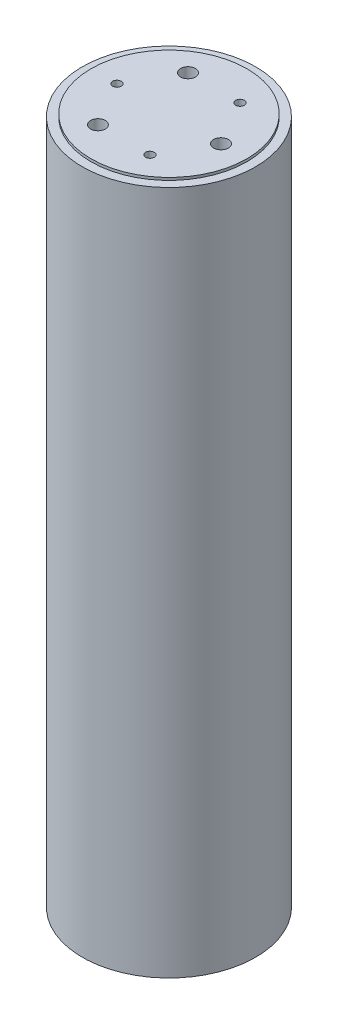
ISO-10303-21;
HEADER;
FILE_DESCRIPTION(('STEP AP214'),'2;1');
FILE_NAME('part.step','',(''),(''),'','','');
FILE_SCHEMA(('AUTOMOTIVE_DESIGN { 1 0 10303 214 1 1 1 1 }'));
ENDSEC;
DATA;
#1=APPLICATION_CONTEXT('core data for automotive mechanical design processes');
#2=APPLICATION_PROTOCOL_DEFINITION('international standard','automotive_design',2000,#1);
#3=PRODUCT_CONTEXT('',#1,'mechanical');
#4=PRODUCT('Part','Part','',(#3));
#5=PRODUCT_RELATED_PRODUCT_CATEGORY('part','',(#4));
#6=PRODUCT_DEFINITION_FORMATION('','',#4);
#7=PRODUCT_DEFINITION_CONTEXT('part definition',#1,'design');
#8=PRODUCT_DEFINITION('design','',#6,#7);
#9=PRODUCT_DEFINITION_SHAPE('','',#8);
#10=(LENGTH_UNIT() NAMED_UNIT(*) SI_UNIT(.MILLI.,.METRE.));
#11=(NAMED_UNIT(*) PLANE_ANGLE_UNIT() SI_UNIT($,.RADIAN.));
#12=(NAMED_UNIT(*) SI_UNIT($,.STERADIAN.) SOLID_ANGLE_UNIT());
#13=UNCERTAINTY_MEASURE_WITH_UNIT(LENGTH_MEASURE(1.E-05),#10,'distance_accuracy_value','');
#14=(GEOMETRIC_REPRESENTATION_CONTEXT(3) GLOBAL_UNCERTAINTY_ASSIGNED_CONTEXT((#13)) GLOBAL_UNIT_ASSIGNED_CONTEXT((#10,
#11,#12)) REPRESENTATION_CONTEXT('',''));
#15=CARTESIAN_POINT('',(0.,0.,0.));
#16=DIRECTION('',(0.,0.,1.));
#17=DIRECTION('',(1.,0.,0.));
#18=AXIS2_PLACEMENT_3D('',#15,#16,#17);
#19=CARTESIAN_POINT('',(0.,388.5,0.));
#20=DIRECTION('',(0.,-1.,0.));
#21=DIRECTION('',(0.,0.,-1.));
#22=AXIS2_PLACEMENT_3D('',#19,#20,#21);
#23=PLANE('',#22);
#24=CARTESIAN_POINT('',(30.,388.5,0.));
#25=DIRECTION('',(0.,-1.,0.));
#26=DIRECTION('',(0.,0.,-1.));
#27=AXIS2_PLACEMENT_3D('',#24,#25,#26);
#28=CIRCLE('',#27,4.28000000000001);
#29=CARTESIAN_POINT('',(30.,388.5,-4.28000000000001));
#30=VERTEX_POINT('',#29);
#31=EDGE_CURVE('E246',#30,#30,#28,.T.);
#32=ORIENTED_EDGE('',*,*,#31,.F.);
#33=EDGE_LOOP('',(#32));
#34=FACE_BOUND('',#33,.T.);
#35=CARTESIAN_POINT('',(-15.0000000000001,388.5,25.9807621135331));
#36=DIRECTION('',(0.,-1.,0.));
#37=DIRECTION('',(0.,0.,-1.));
#38=AXIS2_PLACEMENT_3D('',#35,#36,#37);
#39=CIRCLE('',#38,4.28);
#40=CARTESIAN_POINT('',(-15.0000000000001,388.5,21.7007621135331));
#41=VERTEX_POINT('',#40);
#42=EDGE_CURVE('E254',#41,#41,#39,.T.);
#43=ORIENTED_EDGE('',*,*,#42,.F.);
#44=EDGE_LOOP('',(#43));
#45=FACE_BOUND('',#44,.T.);
#46=CARTESIAN_POINT('',(-14.9999999999998,388.5,-25.9807621135333));
#47=DIRECTION('',(0.,-1.,0.));
#48=DIRECTION('',(0.,0.,-1.));
#49=AXIS2_PLACEMENT_3D('',#46,#47,#48);
#50=CIRCLE('',#49,4.28000000000001);
#51=CARTESIAN_POINT('',(-14.9999999999998,388.5,-30.2607621135333));
#52=VERTEX_POINT('',#51);
#53=EDGE_CURVE('E250',#52,#52,#50,.T.);
#54=ORIENTED_EDGE('',*,*,#53,.F.);
#55=EDGE_LOOP('',(#54));
#56=FACE_BOUND('',#55,.T.);
#57=CARTESIAN_POINT('',(0.,388.5,0.));
#58=DIRECTION('',(0.,-1.,0.));
#59=DIRECTION('',(0.,0.,-1.));
#60=AXIS2_PLACEMENT_3D('',#57,#58,#59);
#61=CIRCLE('',#60,48.);
#62=CARTESIAN_POINT('',(0.,388.5,-48.));
#63=VERTEX_POINT('',#62);
#64=EDGE_CURVE('E88',#63,#63,#61,.T.);
#65=ORIENTED_EDGE('',*,*,#64,.T.);
#66=EDGE_LOOP('',(#65));
#67=FACE_BOUND('',#66,.T.);
#68=ADVANCED_FACE('F45',(#34,#45,#56,#67),#23,.T.);
#69=CARTESIAN_POINT('',(0.,0.,0.));
#70=DIRECTION('',(0.,-1.,0.));
#71=DIRECTION('',(0.,0.,-1.));
#72=AXIS2_PLACEMENT_3D('',#69,#70,#71);
#73=CYLINDRICAL_SURFACE('',#72,48.);
#74=CARTESIAN_POINT('',(0.,9.5,0.));
#75=DIRECTION('',(0.,-1.,0.));
#76=DIRECTION('',(0.,0.,-1.));
#77=AXIS2_PLACEMENT_3D('',#74,#75,#76);
#78=CIRCLE('',#77,48.);
#79=CARTESIAN_POINT('',(0.,9.5,-48.));
#80=VERTEX_POINT('',#79);
#81=EDGE_CURVE('E85',#80,#80,#78,.T.);
#82=ORIENTED_EDGE('',*,*,#81,.T.);
#83=EDGE_LOOP('',(#82));
#84=FACE_BOUND('',#83,.T.);
#85=ORIENTED_EDGE('',*,*,#64,.F.);
#86=EDGE_LOOP('',(#85));
#87=FACE_BOUND('',#86,.T.);
#88=ADVANCED_FACE('F129',(#84,#87),#73,.F.);
#89=CARTESIAN_POINT('',(0.,9.5,-48.));
#90=DIRECTION('',(0.,1.,0.));
#91=DIRECTION('',(0.,0.,1.));
#92=AXIS2_PLACEMENT_3D('',#89,#90,#91);
#93=PLANE('',#92);
#94=CARTESIAN_POINT('',(0.,9.5,0.));
#95=DIRECTION('',(0.,1.,0.));
#96=DIRECTION('',(0.,0.,1.));
#97=AXIS2_PLACEMENT_3D('',#94,#95,#96);
#98=CIRCLE('',#97,5.7);
#99=CARTESIAN_POINT('',(0.,9.5,5.7));
#100=VERTEX_POINT('',#99);
#101=EDGE_CURVE('E89',#100,#100,#98,.T.);
#102=ORIENTED_EDGE('',*,*,#101,.F.);
#103=EDGE_LOOP('',(#102));
#104=FACE_BOUND('',#103,.T.);
#105=CARTESIAN_POINT('',(30.,9.5,0.));
#106=DIRECTION('',(0.,1.,0.));
#107=DIRECTION('',(0.,0.,1.));
#108=AXIS2_PLACEMENT_3D('',#105,#106,#107);
#109=CIRCLE('',#108,4.28000000000001);
#110=CARTESIAN_POINT('',(30.,9.5,4.28000000000001));
#111=VERTEX_POINT('',#110);
#112=EDGE_CURVE('E84',#111,#111,#109,.T.);
#113=ORIENTED_EDGE('',*,*,#112,.F.);
#114=EDGE_LOOP('',(#113));
#115=FACE_BOUND('',#114,.T.);
#116=ORIENTED_EDGE('',*,*,#81,.F.);
#117=EDGE_LOOP('',(#116));
#118=FACE_BOUND('',#117,.T.);
#119=ADVANCED_FACE('F135',(#104,#115,#118),#93,.T.);
#120=CARTESIAN_POINT('',(30.,33.,0.));
#121=DIRECTION('',(0.,-1.,0.));
#122=DIRECTION('',(0.,0.,-1.));
#123=AXIS2_PLACEMENT_3D('',#120,#121,#122);
#124=CYLINDRICAL_SURFACE('',#123,4.28000000000001);
#125=ORIENTED_EDGE('',*,*,#112,.T.);
#126=EDGE_LOOP('',(#125));
#127=FACE_BOUND('',#126,.T.);
#128=CARTESIAN_POINT('',(30.,0.,0.));
#129=DIRECTION('',(0.,-1.,0.));
#130=DIRECTION('',(0.,0.,-1.));
#131=AXIS2_PLACEMENT_3D('',#128,#129,#130);
#132=CIRCLE('',#131,4.28000000000001);
#133=CARTESIAN_POINT('',(30.,0.,-4.28000000000001));
#134=VERTEX_POINT('',#133);
#135=EDGE_CURVE('E66',#134,#134,#132,.T.);
#136=ORIENTED_EDGE('',*,*,#135,.T.);
#137=EDGE_LOOP('',(#136));
#138=FACE_BOUND('',#137,.T.);
#139=ADVANCED_FACE('F164',(#127,#138),#124,.F.);
#140=CARTESIAN_POINT('',(0.,33.,0.));
#141=DIRECTION('',(0.,-1.,0.));
#142=DIRECTION('',(0.,0.,-1.));
#143=AXIS2_PLACEMENT_3D('',#140,#141,#142);
#144=CYLINDRICAL_SURFACE('',#143,5.7);
#145=CARTESIAN_POINT('',(0.,2.20000000000004,0.));
#146=DIRECTION('',(0.,-1.,0.));
#147=DIRECTION('',(0.,0.,-1.));
#148=AXIS2_PLACEMENT_3D('',#145,#146,#147);
#149=CIRCLE('',#148,5.7);
#150=CARTESIAN_POINT('',(0.,2.20000000000004,-5.7));
#151=VERTEX_POINT('',#150);
#152=EDGE_CURVE('E58',#151,#151,#149,.T.);
#153=ORIENTED_EDGE('',*,*,#152,.T.);
#154=EDGE_LOOP('',(#153));
#155=FACE_BOUND('',#154,.T.);
#156=ORIENTED_EDGE('',*,*,#101,.T.);
#157=EDGE_LOOP('',(#156));
#158=FACE_BOUND('',#157,.T.);
#159=ADVANCED_FACE('F110',(#155,#158),#144,.F.);
#160=CARTESIAN_POINT('',(0.,0.,0.));
#161=DIRECTION('',(0.,-1.,0.));
#162=DIRECTION('',(0.,0.,-1.));
#163=AXIS2_PLACEMENT_3D('',#160,#161,#162);
#164=PLANE('',#163);
#165=CARTESIAN_POINT('',(0.,0.,0.));
#166=DIRECTION('',(0.,-1.,0.));
#167=DIRECTION('',(0.,0.,-1.));
#168=AXIS2_PLACEMENT_3D('',#165,#166,#167);
#169=CIRCLE('',#168,7.90000000000007);
#170=CARTESIAN_POINT('',(0.,0.,-7.90000000000007));
#171=VERTEX_POINT('',#170);
#172=EDGE_CURVE('E50',#171,#171,#169,.F.);
#173=ORIENTED_EDGE('',*,*,#172,.T.);
#174=EDGE_LOOP('',(#173));
#175=FACE_BOUND('',#174,.T.);
#176=CARTESIAN_POINT('',(-30.,0.,0.));
#177=DIRECTION('',(0.,-1.,0.));
#178=DIRECTION('',(0.,0.,-1.));
#179=AXIS2_PLACEMENT_3D('',#176,#177,#178);
#180=CIRCLE('',#179,2.5);
#181=CARTESIAN_POINT('',(-30.,0.,-2.5));
#182=VERTEX_POINT('',#181);
#183=EDGE_CURVE('E67',#182,#182,#180,.T.);
#184=ORIENTED_EDGE('',*,*,#183,.F.);
#185=EDGE_LOOP('',(#184));
#186=FACE_BOUND('',#185,.T.);
#187=CARTESIAN_POINT('',(15.0000000000001,0.,25.9807621135331));
#188=DIRECTION('',(0.,-1.,0.));
#189=DIRECTION('',(0.,0.,-1.));
#190=AXIS2_PLACEMENT_3D('',#187,#188,#189);
#191=CIRCLE('',#190,2.5);
#192=CARTESIAN_POINT('',(15.0000000000001,0.,23.4807621135331));
#193=VERTEX_POINT('',#192);
#194=EDGE_CURVE('E70',#193,#193,#191,.T.);
#195=ORIENTED_EDGE('',*,*,#194,.F.);
#196=EDGE_LOOP('',(#195));
#197=FACE_BOUND('',#196,.T.);
#198=CARTESIAN_POINT('',(14.9999999999998,0.,-25.9807621135333));
#199=DIRECTION('',(0.,-1.,0.));
#200=DIRECTION('',(0.,0.,-1.));
#201=AXIS2_PLACEMENT_3D('',#198,#199,#200);
#202=CIRCLE('',#201,2.5);
#203=CARTESIAN_POINT('',(14.9999999999998,0.,-28.4807621135333));
#204=VERTEX_POINT('',#203);
#205=EDGE_CURVE('E76',#204,#204,#202,.T.);
#206=ORIENTED_EDGE('',*,*,#205,.F.);
#207=EDGE_LOOP('',(#206));
#208=FACE_BOUND('',#207,.T.);
#209=ORIENTED_EDGE('',*,*,#135,.F.);
#210=EDGE_LOOP('',(#209));
#211=FACE_BOUND('',#210,.T.);
#212=CARTESIAN_POINT('',(0.,0.,0.));
#213=DIRECTION('',(0.,-1.,0.));
#214=DIRECTION('',(0.,0.,-1.));
#215=AXIS2_PLACEMENT_3D('',#212,#213,#214);
#216=CIRCLE('',#215,45.);
#217=CARTESIAN_POINT('',(0.,0.,-45.));
#218=VERTEX_POINT('',#217);
#219=EDGE_CURVE('E101',#218,#218,#216,.T.);
#220=ORIENTED_EDGE('',*,*,#219,.T.);
#221=EDGE_LOOP('',(#220));
#222=FACE_BOUND('',#221,.T.);
#223=ADVANCED_FACE('F157',(#175,#186,#197,#208,#211,#222),#164,.T.);
#224=CARTESIAN_POINT('',(0.,0.,0.));
#225=DIRECTION('',(0.,-1.,0.));
#226=DIRECTION('',(0.,0.,-1.));
#227=AXIS2_PLACEMENT_3D('',#224,#225,#226);
#228=CYLINDRICAL_SURFACE('',#227,45.);
#229=CARTESIAN_POINT('',(0.,1.5,0.));
#230=DIRECTION('',(0.,-1.,0.));
#231=DIRECTION('',(0.,0.,-1.));
#232=AXIS2_PLACEMENT_3D('',#229,#230,#231);
#233=CIRCLE('',#232,45.);
#234=CARTESIAN_POINT('',(0.,1.5,-45.));
#235=VERTEX_POINT('',#234);
#236=EDGE_CURVE('E98',#235,#235,#233,.T.);
#237=ORIENTED_EDGE('',*,*,#236,.T.);
#238=EDGE_LOOP('',(#237));
#239=FACE_BOUND('',#238,.T.);
#240=ORIENTED_EDGE('',*,*,#219,.F.);
#241=EDGE_LOOP('',(#240));
#242=FACE_BOUND('',#241,.T.);
#243=ADVANCED_FACE('F154',(#239,#242),#228,.T.);
#244=CARTESIAN_POINT('',(0.,1.5,-45.));
#245=DIRECTION('',(0.,-1.,0.));
#246=DIRECTION('',(0.,0.,-1.));
#247=AXIS2_PLACEMENT_3D('',#244,#245,#246);
#248=PLANE('',#247);
#249=CARTESIAN_POINT('',(0.,1.5,0.));
#250=DIRECTION('',(0.,-1.,0.));
#251=DIRECTION('',(0.,0.,-1.));
#252=AXIS2_PLACEMENT_3D('',#249,#250,#251);
#253=CIRCLE('',#252,50.);
#254=CARTESIAN_POINT('',(0.,1.5,-50.));
#255=VERTEX_POINT('',#254);
#256=EDGE_CURVE('E95',#255,#255,#253,.T.);
#257=ORIENTED_EDGE('',*,*,#256,.T.);
#258=EDGE_LOOP('',(#257));
#259=FACE_BOUND('',#258,.T.);
#260=ORIENTED_EDGE('',*,*,#236,.F.);
#261=EDGE_LOOP('',(#260));
#262=FACE_BOUND('',#261,.T.);
#263=ADVANCED_FACE('F150',(#259,#262),#248,.T.);
#264=CARTESIAN_POINT('',(0.,0.,0.));
#265=DIRECTION('',(0.,-1.,0.));
#266=DIRECTION('',(0.,0.,-1.));
#267=AXIS2_PLACEMENT_3D('',#264,#265,#266);
#268=CYLINDRICAL_SURFACE('',#267,50.);
#269=CARTESIAN_POINT('',(0.,396.5,0.));
#270=DIRECTION('',(0.,-1.,0.));
#271=DIRECTION('',(0.,0.,-1.));
#272=AXIS2_PLACEMENT_3D('',#269,#270,#271);
#273=CIRCLE('',#272,50.);
#274=CARTESIAN_POINT('',(0.,396.5,-50.));
#275=VERTEX_POINT('',#274);
#276=EDGE_CURVE('E92',#275,#275,#273,.T.);
#277=ORIENTED_EDGE('',*,*,#276,.T.);
#278=EDGE_LOOP('',(#277));
#279=FACE_BOUND('',#278,.T.);
#280=ORIENTED_EDGE('',*,*,#256,.F.);
#281=EDGE_LOOP('',(#280));
#282=FACE_BOUND('',#281,.T.);
#283=ADVANCED_FACE('F146',(#279,#282),#268,.T.);
#284=CARTESIAN_POINT('',(0.,396.5,-50.));
#285=DIRECTION('',(0.,1.,0.));
#286=DIRECTION('',(0.,0.,1.));
#287=AXIS2_PLACEMENT_3D('',#284,#285,#286);
#288=PLANE('',#287);
#289=CARTESIAN_POINT('',(0.,396.5,0.));
#290=DIRECTION('',(0.,1.,0.));
#291=DIRECTION('',(0.,0.,1.));
#292=AXIS2_PLACEMENT_3D('',#289,#290,#291);
#293=CIRCLE('',#292,45.);
#294=CARTESIAN_POINT('',(0.,396.5,45.));
#295=VERTEX_POINT('',#294);
#296=EDGE_CURVE('E10',#295,#295,#293,.T.);
#297=ORIENTED_EDGE('',*,*,#296,.F.);
#298=EDGE_LOOP('',(#297));
#299=FACE_BOUND('',#298,.T.);
#300=ORIENTED_EDGE('',*,*,#276,.F.);
#301=EDGE_LOOP('',(#300));
#302=FACE_BOUND('',#301,.T.);
#303=ADVANCED_FACE('F142',(#299,#302),#288,.T.);
#304=CARTESIAN_POINT('',(14.9999999999998,5.,-25.9807621135333));
#305=DIRECTION('',(0.,-1.,0.));
#306=DIRECTION('',(0.,0.,-1.));
#307=AXIS2_PLACEMENT_3D('',#304,#305,#306);
#308=CYLINDRICAL_SURFACE('',#307,2.5);
#309=CARTESIAN_POINT('',(14.9999999999998,5.,-25.9807621135333));
#310=DIRECTION('',(0.,-1.,0.));
#311=DIRECTION('',(0.,0.,-1.));
#312=AXIS2_PLACEMENT_3D('',#309,#310,#311);
#313=CIRCLE('',#312,2.5);
#314=CARTESIAN_POINT('',(14.9999999999998,5.,-28.4807621135333));
#315=VERTEX_POINT('',#314);
#316=EDGE_CURVE('E79',#315,#315,#313,.T.);
#317=ORIENTED_EDGE('',*,*,#316,.F.);
#318=EDGE_LOOP('',(#317));
#319=FACE_BOUND('',#318,.T.);
#320=ORIENTED_EDGE('',*,*,#205,.T.);
#321=EDGE_LOOP('',(#320));
#322=FACE_BOUND('',#321,.T.);
#323=ADVANCED_FACE('F145',(#319,#322),#308,.F.);
#324=CARTESIAN_POINT('',(14.9999999999998,5.,-25.9807621135333));
#325=DIRECTION('',(0.,-1.,0.));
#326=DIRECTION('',(0.,0.,-1.));
#327=AXIS2_PLACEMENT_3D('',#324,#325,#326);
#328=PLANE('',#327);
#329=ORIENTED_EDGE('',*,*,#316,.T.);
#330=EDGE_LOOP('',(#329));
#331=FACE_BOUND('',#330,.T.);
#332=ADVANCED_FACE('F186',(#331),#328,.T.);
#333=CARTESIAN_POINT('',(15.0000000000001,5.,25.9807621135331));
#334=DIRECTION('',(0.,-1.,0.));
#335=DIRECTION('',(0.,0.,-1.));
#336=AXIS2_PLACEMENT_3D('',#333,#334,#335);
#337=CYLINDRICAL_SURFACE('',#336,2.5);
#338=CARTESIAN_POINT('',(15.0000000000001,5.,25.9807621135331));
#339=DIRECTION('',(0.,-1.,0.));
#340=DIRECTION('',(0.,0.,-1.));
#341=AXIS2_PLACEMENT_3D('',#338,#339,#340);
#342=CIRCLE('',#341,2.5);
#343=CARTESIAN_POINT('',(15.0000000000001,5.,23.4807621135331));
#344=VERTEX_POINT('',#343);
#345=EDGE_CURVE('E73',#344,#344,#342,.T.);
#346=ORIENTED_EDGE('',*,*,#345,.F.);
#347=EDGE_LOOP('',(#346));
#348=FACE_BOUND('',#347,.T.);
#349=ORIENTED_EDGE('',*,*,#194,.T.);
#350=EDGE_LOOP('',(#349));
#351=FACE_BOUND('',#350,.T.);
#352=ADVANCED_FACE('F189',(#348,#351),#337,.F.);
#353=CARTESIAN_POINT('',(15.0000000000001,5.,25.9807621135331));
#354=DIRECTION('',(0.,-1.,0.));
#355=DIRECTION('',(0.,0.,-1.));
#356=AXIS2_PLACEMENT_3D('',#353,#354,#355);
#357=PLANE('',#356);
#358=ORIENTED_EDGE('',*,*,#345,.T.);
#359=EDGE_LOOP('',(#358));
#360=FACE_BOUND('',#359,.T.);
#361=ADVANCED_FACE('F194',(#360),#357,.T.);
#362=CARTESIAN_POINT('',(-30.,5.,0.));
#363=DIRECTION('',(0.,-1.,0.));
#364=DIRECTION('',(0.,0.,-1.));
#365=AXIS2_PLACEMENT_3D('',#362,#363,#364);
#366=CYLINDRICAL_SURFACE('',#365,2.5);
#367=CARTESIAN_POINT('',(-30.,5.,0.));
#368=DIRECTION('',(0.,-1.,0.));
#369=DIRECTION('',(0.,0.,-1.));
#370=AXIS2_PLACEMENT_3D('',#367,#368,#369);
#371=CIRCLE('',#370,2.5);
#372=CARTESIAN_POINT('',(-30.,5.,-2.5));
#373=VERTEX_POINT('',#372);
#374=EDGE_CURVE('E63',#373,#373,#371,.T.);
#375=ORIENTED_EDGE('',*,*,#374,.F.);
#376=EDGE_LOOP('',(#375));
#377=FACE_BOUND('',#376,.T.);
#378=ORIENTED_EDGE('',*,*,#183,.T.);
#379=EDGE_LOOP('',(#378));
#380=FACE_BOUND('',#379,.T.);
#381=ADVANCED_FACE('F124',(#377,#380),#366,.F.);
#382=CARTESIAN_POINT('',(-30.,5.,0.));
#383=DIRECTION('',(0.,-1.,0.));
#384=DIRECTION('',(0.,0.,-1.));
#385=AXIS2_PLACEMENT_3D('',#382,#383,#384);
#386=PLANE('',#385);
#387=ORIENTED_EDGE('',*,*,#374,.T.);
#388=EDGE_LOOP('',(#387));
#389=FACE_BOUND('',#388,.T.);
#390=ADVANCED_FACE('F115',(#389),#386,.T.);
#391=CARTESIAN_POINT('',(0.,2.20000000000004,0.));
#392=DIRECTION('',(0.,-1.,0.));
#393=DIRECTION('',(0.,0.,-1.));
#394=AXIS2_PLACEMENT_3D('',#391,#392,#393);
#395=CONICAL_SURFACE('',#394,5.7,0.785398163397456);
#396=ORIENTED_EDGE('',*,*,#172,.F.);
#397=EDGE_LOOP('',(#396));
#398=FACE_BOUND('',#397,.T.);
#399=ORIENTED_EDGE('',*,*,#152,.F.);
#400=EDGE_LOOP('',(#399));
#401=FACE_BOUND('',#400,.T.);
#402=ADVANCED_FACE('F48',(#398,#401),#395,.F.);
#403=CARTESIAN_POINT('',(0.,398.,0.));
#404=DIRECTION('',(0.,-1.,0.));
#405=DIRECTION('',(0.,0.,-1.));
#406=AXIS2_PLACEMENT_3D('',#403,#404,#405);
#407=CYLINDRICAL_SURFACE('',#406,45.);
#408=CARTESIAN_POINT('',(0.,398.,0.));
#409=DIRECTION('',(0.,1.,0.));
#410=DIRECTION('',(0.,0.,1.));
#411=AXIS2_PLACEMENT_3D('',#408,#409,#410);
#412=CIRCLE('',#411,45.);
#413=CARTESIAN_POINT('',(0.,398.,45.));
#414=VERTEX_POINT('',#413);
#415=EDGE_CURVE('E61',#414,#414,#412,.T.);
#416=ORIENTED_EDGE('',*,*,#415,.F.);
#417=EDGE_LOOP('',(#416));
#418=FACE_BOUND('',#417,.T.);
#419=ORIENTED_EDGE('',*,*,#296,.T.);
#420=EDGE_LOOP('',(#419));
#421=FACE_BOUND('',#420,.T.);
#422=ADVANCED_FACE('F114',(#418,#421),#407,.T.);
#423=CARTESIAN_POINT('',(0.,398.,0.));
#424=DIRECTION('',(0.,1.,0.));
#425=DIRECTION('',(0.,0.,1.));
#426=AXIS2_PLACEMENT_3D('',#423,#424,#425);
#427=PLANE('',#426);
#428=CARTESIAN_POINT('',(30.,398.,0.));
#429=DIRECTION('',(0.,1.,0.));
#430=DIRECTION('',(0.,0.,1.));
#431=AXIS2_PLACEMENT_3D('',#428,#429,#430);
#432=CIRCLE('',#431,4.28000000000001);
#433=CARTESIAN_POINT('',(30.,398.,4.28000000000001));
#434=VERTEX_POINT('',#433);
#435=EDGE_CURVE('E249',#434,#434,#432,.T.);
#436=ORIENTED_EDGE('',*,*,#435,.F.);
#437=EDGE_LOOP('',(#436));
#438=FACE_BOUND('',#437,.T.);
#439=CARTESIAN_POINT('',(-15.0000000000001,398.,25.9807621135331));
#440=DIRECTION('',(0.,1.,0.));
#441=DIRECTION('',(0.,0.,1.));
#442=AXIS2_PLACEMENT_3D('',#439,#440,#441);
#443=CIRCLE('',#442,4.28);
#444=CARTESIAN_POINT('',(-15.0000000000001,398.,30.2607621135331));
#445=VERTEX_POINT('',#444);
#446=EDGE_CURVE('E251',#445,#445,#443,.T.);
#447=ORIENTED_EDGE('',*,*,#446,.F.);
#448=EDGE_LOOP('',(#447));
#449=FACE_BOUND('',#448,.T.);
#450=CARTESIAN_POINT('',(-14.9999999999998,398.,-25.9807621135333));
#451=DIRECTION('',(0.,1.,0.));
#452=DIRECTION('',(0.,0.,1.));
#453=AXIS2_PLACEMENT_3D('',#450,#451,#452);
#454=CIRCLE('',#453,4.28000000000001);
#455=CARTESIAN_POINT('',(-14.9999999999998,398.,-21.7007621135333));
#456=VERTEX_POINT('',#455);
#457=EDGE_CURVE('E257',#456,#456,#454,.T.);
#458=ORIENTED_EDGE('',*,*,#457,.F.);
#459=EDGE_LOOP('',(#458));
#460=FACE_BOUND('',#459,.T.);
#461=CARTESIAN_POINT('',(-30.,398.,0.));
#462=DIRECTION('',(0.,1.,0.));
#463=DIRECTION('',(0.,0.,1.));
#464=AXIS2_PLACEMENT_3D('',#461,#462,#463);
#465=CIRCLE('',#464,2.5);
#466=CARTESIAN_POINT('',(-30.,398.,2.5));
#467=VERTEX_POINT('',#466);
#468=EDGE_CURVE('E269',#467,#467,#465,.T.);
#469=ORIENTED_EDGE('',*,*,#468,.F.);
#470=EDGE_LOOP('',(#469));
#471=FACE_BOUND('',#470,.T.);
#472=CARTESIAN_POINT('',(15.0000000000001,398.,-25.9807621135331));
#473=DIRECTION('',(0.,1.,0.));
#474=DIRECTION('',(0.,0.,1.));
#475=AXIS2_PLACEMENT_3D('',#472,#473,#474);
#476=CIRCLE('',#475,2.5);
#477=CARTESIAN_POINT('',(15.0000000000001,398.,-23.4807621135331));
#478=VERTEX_POINT('',#477);
#479=EDGE_CURVE('E272',#478,#478,#476,.T.);
#480=ORIENTED_EDGE('',*,*,#479,.F.);
#481=EDGE_LOOP('',(#480));
#482=FACE_BOUND('',#481,.T.);
#483=CARTESIAN_POINT('',(14.9999999999998,398.,25.9807621135333));
#484=DIRECTION('',(0.,1.,0.));
#485=DIRECTION('',(0.,0.,1.));
#486=AXIS2_PLACEMENT_3D('',#483,#484,#485);
#487=CIRCLE('',#486,2.5);
#488=CARTESIAN_POINT('',(14.9999999999998,398.,28.4807621135333));
#489=VERTEX_POINT('',#488);
#490=EDGE_CURVE('E278',#489,#489,#487,.T.);
#491=ORIENTED_EDGE('',*,*,#490,.F.);
#492=EDGE_LOOP('',(#491));
#493=FACE_BOUND('',#492,.T.);
#494=ORIENTED_EDGE('',*,*,#415,.T.);
#495=EDGE_LOOP('',(#494));
#496=FACE_BOUND('',#495,.T.);
#497=ADVANCED_FACE('F121',(#438,#449,#460,#471,#482,#493,#496),#427,.T.);
#498=CARTESIAN_POINT('',(14.9999999999998,393.,25.9807621135333));
#499=DIRECTION('',(0.,1.,0.));
#500=DIRECTION('',(0.,0.,1.));
#501=AXIS2_PLACEMENT_3D('',#498,#499,#500);
#502=CYLINDRICAL_SURFACE('',#501,2.5);
#503=CARTESIAN_POINT('',(14.9999999999998,393.,25.9807621135333));
#504=DIRECTION('',(0.,1.,0.));
#505=DIRECTION('',(0.,0.,1.));
#506=AXIS2_PLACEMENT_3D('',#503,#504,#505);
#507=CIRCLE('',#506,2.5);
#508=CARTESIAN_POINT('',(14.9999999999998,393.,28.4807621135333));
#509=VERTEX_POINT('',#508);
#510=EDGE_CURVE('E265',#509,#509,#507,.T.);
#511=ORIENTED_EDGE('',*,*,#510,.F.);
#512=EDGE_LOOP('',(#511));
#513=FACE_BOUND('',#512,.T.);
#514=ORIENTED_EDGE('',*,*,#490,.T.);
#515=EDGE_LOOP('',(#514));
#516=FACE_BOUND('',#515,.T.);
#517=ADVANCED_FACE('F206',(#513,#516),#502,.F.);
#518=CARTESIAN_POINT('',(14.9999999999998,393.,25.9807621135333));
#519=DIRECTION('',(0.,1.,0.));
#520=DIRECTION('',(0.,0.,1.));
#521=AXIS2_PLACEMENT_3D('',#518,#519,#520);
#522=PLANE('',#521);
#523=ORIENTED_EDGE('',*,*,#510,.T.);
#524=EDGE_LOOP('',(#523));
#525=FACE_BOUND('',#524,.T.);
#526=ADVANCED_FACE('F208',(#525),#522,.T.);
#527=CARTESIAN_POINT('',(15.0000000000001,393.,-25.9807621135331));
#528=DIRECTION('',(0.,1.,0.));
#529=DIRECTION('',(0.,0.,1.));
#530=AXIS2_PLACEMENT_3D('',#527,#528,#529);
#531=CYLINDRICAL_SURFACE('',#530,2.5);
#532=CARTESIAN_POINT('',(15.0000000000001,393.,-25.9807621135331));
#533=DIRECTION('',(0.,1.,0.));
#534=DIRECTION('',(0.,0.,1.));
#535=AXIS2_PLACEMENT_3D('',#532,#533,#534);
#536=CIRCLE('',#535,2.5);
#537=CARTESIAN_POINT('',(15.0000000000001,393.,-23.4807621135331));
#538=VERTEX_POINT('',#537);
#539=EDGE_CURVE('E275',#538,#538,#536,.T.);
#540=ORIENTED_EDGE('',*,*,#539,.F.);
#541=EDGE_LOOP('',(#540));
#542=FACE_BOUND('',#541,.T.);
#543=ORIENTED_EDGE('',*,*,#479,.T.);
#544=EDGE_LOOP('',(#543));
#545=FACE_BOUND('',#544,.T.);
#546=ADVANCED_FACE('F211',(#542,#545),#531,.F.);
#547=CARTESIAN_POINT('',(15.0000000000001,393.,-25.9807621135331));
#548=DIRECTION('',(0.,1.,0.));
#549=DIRECTION('',(0.,0.,1.));
#550=AXIS2_PLACEMENT_3D('',#547,#548,#549);
#551=PLANE('',#550);
#552=ORIENTED_EDGE('',*,*,#539,.T.);
#553=EDGE_LOOP('',(#552));
#554=FACE_BOUND('',#553,.T.);
#555=ADVANCED_FACE('F216',(#554),#551,.T.);
#556=CARTESIAN_POINT('',(-30.,393.,0.));
#557=DIRECTION('',(0.,1.,0.));
#558=DIRECTION('',(0.,0.,1.));
#559=AXIS2_PLACEMENT_3D('',#556,#557,#558);
#560=CYLINDRICAL_SURFACE('',#559,2.5);
#561=CARTESIAN_POINT('',(-30.,393.,0.));
#562=DIRECTION('',(0.,1.,0.));
#563=DIRECTION('',(0.,0.,1.));
#564=AXIS2_PLACEMENT_3D('',#561,#562,#563);
#565=CIRCLE('',#564,2.5);
#566=CARTESIAN_POINT('',(-30.,393.,2.5));
#567=VERTEX_POINT('',#566);
#568=EDGE_CURVE('E266',#567,#567,#565,.T.);
#569=ORIENTED_EDGE('',*,*,#568,.F.);
#570=EDGE_LOOP('',(#569));
#571=FACE_BOUND('',#570,.T.);
#572=ORIENTED_EDGE('',*,*,#468,.T.);
#573=EDGE_LOOP('',(#572));
#574=FACE_BOUND('',#573,.T.);
#575=ADVANCED_FACE('F219',(#571,#574),#560,.F.);
#576=CARTESIAN_POINT('',(-30.,393.,0.));
#577=DIRECTION('',(0.,1.,0.));
#578=DIRECTION('',(0.,0.,1.));
#579=AXIS2_PLACEMENT_3D('',#576,#577,#578);
#580=PLANE('',#579);
#581=ORIENTED_EDGE('',*,*,#568,.T.);
#582=EDGE_LOOP('',(#581));
#583=FACE_BOUND('',#582,.T.);
#584=ADVANCED_FACE('F226',(#583),#580,.T.);
#585=CARTESIAN_POINT('',(-14.9999999999998,313.,-25.9807621135333));
#586=DIRECTION('',(0.,1.,0.));
#587=DIRECTION('',(0.,0.,1.));
#588=AXIS2_PLACEMENT_3D('',#585,#586,#587);
#589=CYLINDRICAL_SURFACE('',#588,4.28000000000001);
#590=ORIENTED_EDGE('',*,*,#53,.T.);
#591=EDGE_LOOP('',(#590));
#592=FACE_BOUND('',#591,.T.);
#593=ORIENTED_EDGE('',*,*,#457,.T.);
#594=EDGE_LOOP('',(#593));
#595=FACE_BOUND('',#594,.T.);
#596=ADVANCED_FACE('F230',(#592,#595),#589,.F.);
#597=CARTESIAN_POINT('',(-15.0000000000001,313.,25.9807621135331));
#598=DIRECTION('',(0.,1.,0.));
#599=DIRECTION('',(0.,0.,1.));
#600=AXIS2_PLACEMENT_3D('',#597,#598,#599);
#601=CYLINDRICAL_SURFACE('',#600,4.28);
#602=ORIENTED_EDGE('',*,*,#42,.T.);
#603=EDGE_LOOP('',(#602));
#604=FACE_BOUND('',#603,.T.);
#605=ORIENTED_EDGE('',*,*,#446,.T.);
#606=EDGE_LOOP('',(#605));
#607=FACE_BOUND('',#606,.T.);
#608=ADVANCED_FACE('F234',(#604,#607),#601,.F.);
#609=CARTESIAN_POINT('',(30.,313.,0.));
#610=DIRECTION('',(0.,1.,0.));
#611=DIRECTION('',(0.,0.,1.));
#612=AXIS2_PLACEMENT_3D('',#609,#610,#611);
#613=CYLINDRICAL_SURFACE('',#612,4.28000000000001);
#614=ORIENTED_EDGE('',*,*,#31,.T.);
#615=EDGE_LOOP('',(#614));
#616=FACE_BOUND('',#615,.T.);
#617=ORIENTED_EDGE('',*,*,#435,.T.);
#618=EDGE_LOOP('',(#617));
#619=FACE_BOUND('',#618,.T.);
#620=ADVANCED_FACE('F238',(#616,#619),#613,.F.);
#621=CLOSED_SHELL('',(#68,#88,#119,#139,#159,#223,#243,#263,#283,#303,#323,#332,#352,#361,#381,
#390,#402,#422,#497,#517,#526,#546,#555,#575,#584,#596,#608,#620));
#622=MANIFOLD_SOLID_BREP('B2',#621);
#623=ADVANCED_BREP_SHAPE_REPRESENTATION('',(#18,#622),#14);
#624=SHAPE_DEFINITION_REPRESENTATION(#9,#623);
ENDSEC;
END-ISO-10303-21;
